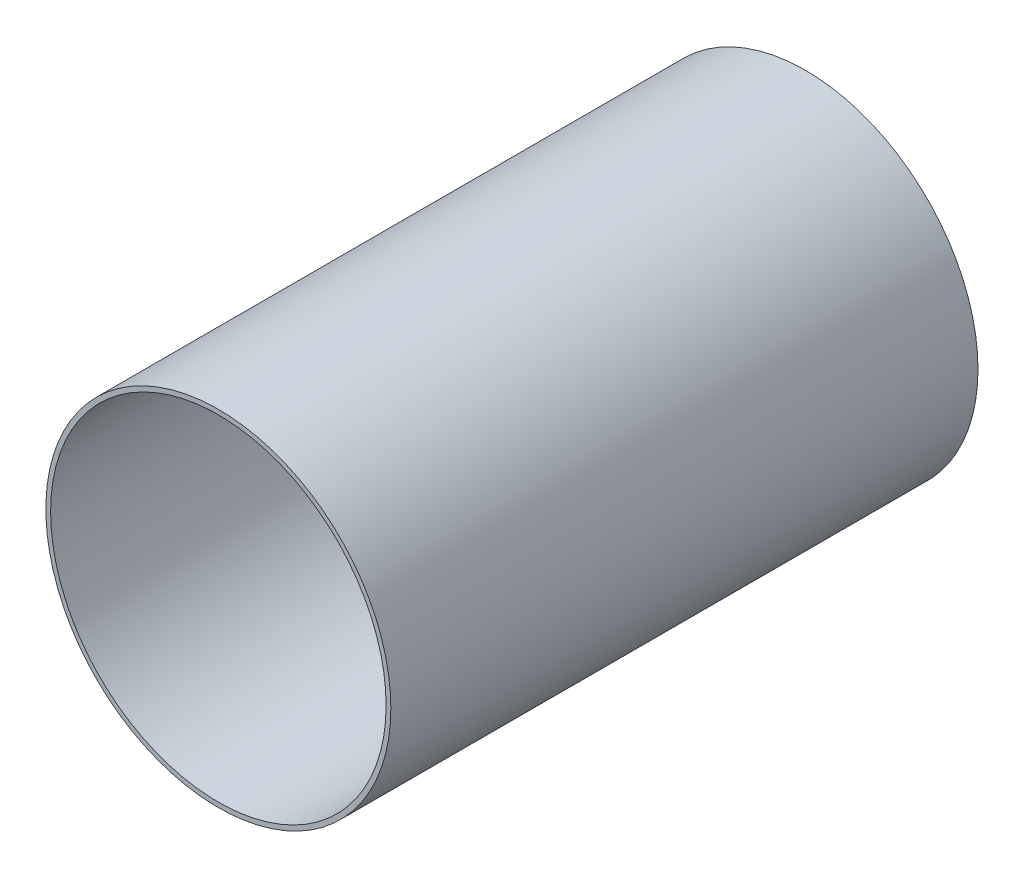
ISO-10303-21;
HEADER;
FILE_DESCRIPTION(('STEP AP214'),'2;1');
FILE_NAME('part.step','',(''),(''),'','','');
FILE_SCHEMA(('AUTOMOTIVE_DESIGN { 1 0 10303 214 1 1 1 1 }'));
ENDSEC;
DATA;
#1=APPLICATION_CONTEXT('core data for automotive mechanical design processes');
#2=APPLICATION_PROTOCOL_DEFINITION('international standard','automotive_design',2000,#1);
#3=PRODUCT_CONTEXT('',#1,'mechanical');
#4=PRODUCT('Part','Part','',(#3));
#5=PRODUCT_RELATED_PRODUCT_CATEGORY('part','',(#4));
#6=PRODUCT_DEFINITION_FORMATION('','',#4);
#7=PRODUCT_DEFINITION_CONTEXT('part definition',#1,'design');
#8=PRODUCT_DEFINITION('design','',#6,#7);
#9=PRODUCT_DEFINITION_SHAPE('','',#8);
#10=(LENGTH_UNIT() NAMED_UNIT(*) SI_UNIT(.MILLI.,.METRE.));
#11=(NAMED_UNIT(*) PLANE_ANGLE_UNIT() SI_UNIT($,.RADIAN.));
#12=(NAMED_UNIT(*) SI_UNIT($,.STERADIAN.) SOLID_ANGLE_UNIT());
#13=UNCERTAINTY_MEASURE_WITH_UNIT(LENGTH_MEASURE(1.E-05),#10,'distance_accuracy_value','');
#14=(GEOMETRIC_REPRESENTATION_CONTEXT(3) GLOBAL_UNCERTAINTY_ASSIGNED_CONTEXT((#13)) GLOBAL_UNIT_ASSIGNED_CONTEXT((#10,
#11,#12)) REPRESENTATION_CONTEXT('',''));
#15=CARTESIAN_POINT('',(0.,0.,0.));
#16=DIRECTION('',(0.,0.,1.));
#17=DIRECTION('',(1.,0.,0.));
#18=AXIS2_PLACEMENT_3D('',#15,#16,#17);
#19=CARTESIAN_POINT('',(0.,0.,266.7));
#20=DIRECTION('',(0.,0.,1.));
#21=DIRECTION('',(1.,0.,0.));
#22=AXIS2_PLACEMENT_3D('',#19,#20,#21);
#23=PLANE('',#22);
#24=CARTESIAN_POINT('',(0.,0.,266.7));
#25=DIRECTION('',(0.,0.,1.));
#26=DIRECTION('',(1.,0.,0.));
#27=AXIS2_PLACEMENT_3D('',#24,#25,#26);
#28=CIRCLE('',#27,78.359);
#29=CARTESIAN_POINT('',(78.359,0.,266.7));
#30=VERTEX_POINT('',#29);
#31=EDGE_CURVE('E10',#30,#30,#28,.T.);
#32=ORIENTED_EDGE('',*,*,#31,.T.);
#33=EDGE_LOOP('',(#32));
#34=FACE_BOUND('',#33,.T.);
#35=CARTESIAN_POINT('',(0.,0.,266.7));
#36=DIRECTION('',(0.,0.,1.));
#37=DIRECTION('',(1.,0.,0.));
#38=AXIS2_PLACEMENT_3D('',#35,#36,#37);
#39=CIRCLE('',#38,76.2);
#40=CARTESIAN_POINT('',(76.2,0.,266.7));
#41=VERTEX_POINT('',#40);
#42=EDGE_CURVE('E50',#41,#41,#39,.T.);
#43=ORIENTED_EDGE('',*,*,#42,.F.);
#44=EDGE_LOOP('',(#43));
#45=FACE_BOUND('',#44,.T.);
#46=ADVANCED_FACE('F37',(#34,#45),#23,.T.);
#47=CARTESIAN_POINT('',(0.,0.,0.));
#48=DIRECTION('',(0.,0.,1.));
#49=DIRECTION('',(1.,0.,0.));
#50=AXIS2_PLACEMENT_3D('',#47,#48,#49);
#51=PLANE('',#50);
#52=CARTESIAN_POINT('',(0.,0.,0.));
#53=DIRECTION('',(0.,0.,1.));
#54=DIRECTION('',(1.,0.,0.));
#55=AXIS2_PLACEMENT_3D('',#52,#53,#54);
#56=CIRCLE('',#55,78.359);
#57=CARTESIAN_POINT('',(78.359,0.,0.));
#58=VERTEX_POINT('',#57);
#59=EDGE_CURVE('E41',#58,#58,#56,.T.);
#60=ORIENTED_EDGE('',*,*,#59,.F.);
#61=EDGE_LOOP('',(#60));
#62=FACE_BOUND('',#61,.T.);
#63=CARTESIAN_POINT('',(0.,0.,0.));
#64=DIRECTION('',(0.,0.,1.));
#65=DIRECTION('',(1.,0.,0.));
#66=AXIS2_PLACEMENT_3D('',#63,#64,#65);
#67=CIRCLE('',#66,76.2);
#68=CARTESIAN_POINT('',(76.2,0.,0.));
#69=VERTEX_POINT('',#68);
#70=EDGE_CURVE('E52',#69,#69,#67,.T.);
#71=ORIENTED_EDGE('',*,*,#70,.T.);
#72=EDGE_LOOP('',(#71));
#73=FACE_BOUND('',#72,.T.);
#74=ADVANCED_FACE('F64',(#62,#73),#51,.F.);
#75=CARTESIAN_POINT('',(0.,0.,266.7));
#76=DIRECTION('',(0.,0.,-1.));
#77=DIRECTION('',(-1.,0.,0.));
#78=AXIS2_PLACEMENT_3D('',#75,#76,#77);
#79=CYLINDRICAL_SURFACE('',#78,78.359);
#80=ORIENTED_EDGE('',*,*,#31,.F.);
#81=EDGE_LOOP('',(#80));
#82=FACE_BOUND('',#81,.T.);
#83=ORIENTED_EDGE('',*,*,#59,.T.);
#84=EDGE_LOOP('',(#83));
#85=FACE_BOUND('',#84,.T.);
#86=ADVANCED_FACE('F39',(#82,#85),#79,.T.);
#87=CARTESIAN_POINT('',(0.,0.,266.7));
#88=DIRECTION('',(0.,0.,-1.));
#89=DIRECTION('',(-1.,0.,0.));
#90=AXIS2_PLACEMENT_3D('',#87,#88,#89);
#91=CYLINDRICAL_SURFACE('',#90,76.2);
#92=ORIENTED_EDGE('',*,*,#42,.T.);
#93=EDGE_LOOP('',(#92));
#94=FACE_BOUND('',#93,.T.);
#95=ORIENTED_EDGE('',*,*,#70,.F.);
#96=EDGE_LOOP('',(#95));
#97=FACE_BOUND('',#96,.T.);
#98=ADVANCED_FACE('F60',(#94,#97),#91,.F.);
#99=CLOSED_SHELL('',(#46,#74,#86,#98));
#100=MANIFOLD_SOLID_BREP('B2',#99);
#101=ADVANCED_BREP_SHAPE_REPRESENTATION('',(#18,#100),#14);
#102=SHAPE_DEFINITION_REPRESENTATION(#9,#101);
ENDSEC;
END-ISO-10303-21;
